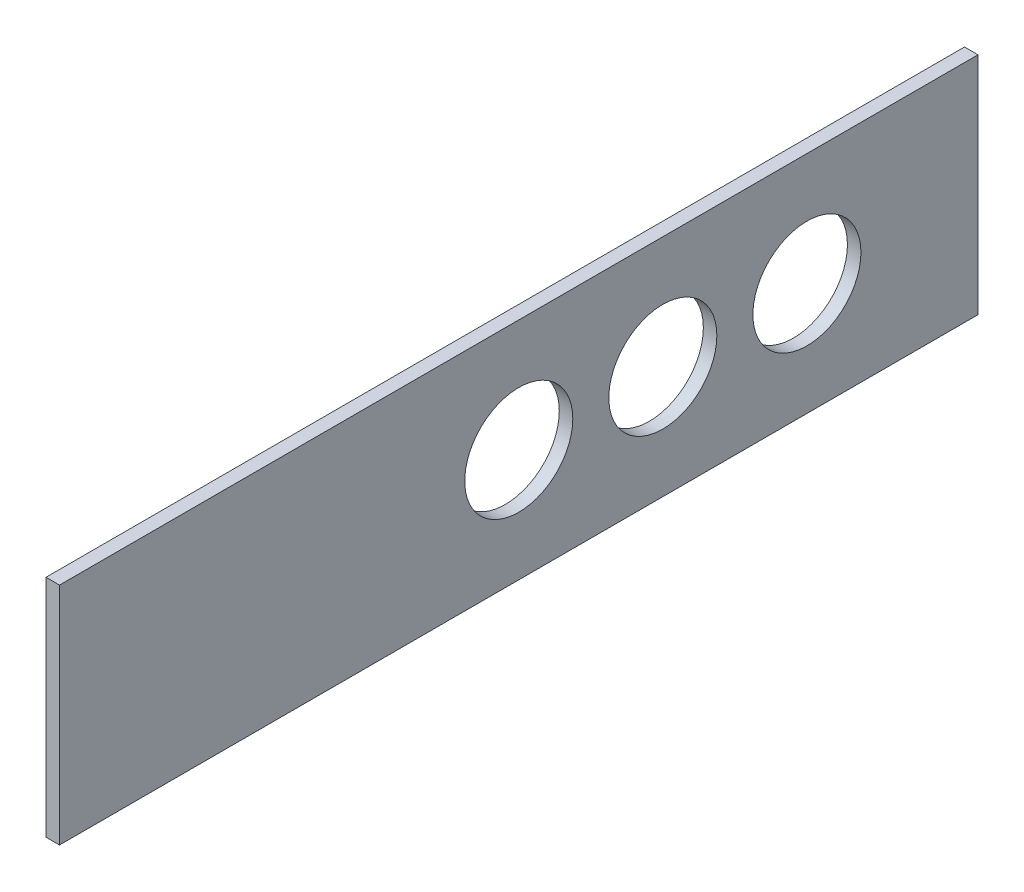
ISO-10303-21;
HEADER;
FILE_DESCRIPTION(('STEP AP214'),'2;1');
FILE_NAME('part.step','',(''),(''),'','','');
FILE_SCHEMA(('AUTOMOTIVE_DESIGN { 1 0 10303 214 1 1 1 1 }'));
ENDSEC;
DATA;
#1=APPLICATION_CONTEXT('core data for automotive mechanical design processes');
#2=APPLICATION_PROTOCOL_DEFINITION('international standard','automotive_design',2000,#1);
#3=PRODUCT_CONTEXT('',#1,'mechanical');
#4=PRODUCT('Part','Part','',(#3));
#5=PRODUCT_RELATED_PRODUCT_CATEGORY('part','',(#4));
#6=PRODUCT_DEFINITION_FORMATION('','',#4);
#7=PRODUCT_DEFINITION_CONTEXT('part definition',#1,'design');
#8=PRODUCT_DEFINITION('design','',#6,#7);
#9=PRODUCT_DEFINITION_SHAPE('','',#8);
#10=(LENGTH_UNIT() NAMED_UNIT(*) SI_UNIT(.MILLI.,.METRE.));
#11=(NAMED_UNIT(*) PLANE_ANGLE_UNIT() SI_UNIT($,.RADIAN.));
#12=(NAMED_UNIT(*) SI_UNIT($,.STERADIAN.) SOLID_ANGLE_UNIT());
#13=UNCERTAINTY_MEASURE_WITH_UNIT(LENGTH_MEASURE(1.E-05),#10,'distance_accuracy_value','');
#14=(GEOMETRIC_REPRESENTATION_CONTEXT(3) GLOBAL_UNCERTAINTY_ASSIGNED_CONTEXT((#13)) GLOBAL_UNIT_ASSIGNED_CONTEXT((#10,
#11,#12)) REPRESENTATION_CONTEXT('',''));
#15=CARTESIAN_POINT('',(0.,0.,0.));
#16=DIRECTION('',(0.,0.,1.));
#17=DIRECTION('',(1.,0.,0.));
#18=AXIS2_PLACEMENT_3D('',#15,#16,#17);
#19=CARTESIAN_POINT('',(3.,-12.1514712163296,0.));
#20=DIRECTION('',(0.,1.,0.));
#21=DIRECTION('',(0.,0.,1.));
#22=AXIS2_PLACEMENT_3D('',#19,#20,#21);
#23=PLANE('',#22);
#24=DIRECTION('',(0.,0.,-1.));
#25=VECTOR('',#24,1.);
#26=CARTESIAN_POINT('',(0.,-12.1514712163296,0.));
#27=LINE('',#26,#25);
#28=CARTESIAN_POINT('',(0.,-12.1514712163296,75.6787660537879));
#29=VERTEX_POINT('',#28);
#30=CARTESIAN_POINT('',(0.,-12.1514712163296,-128.321233946212));
#31=VERTEX_POINT('',#30);
#32=EDGE_CURVE('E121',#29,#31,#27,.T.);
#33=ORIENTED_EDGE('',*,*,#32,.T.);
#34=DIRECTION('',(-1.,0.,0.));
#35=VECTOR('',#34,1.);
#36=CARTESIAN_POINT('',(3.,-12.1514712163296,-128.321233946212));
#37=LINE('',#36,#35);
#38=CARTESIAN_POINT('',(3.,-12.1514712163296,-128.321233946212));
#39=VERTEX_POINT('',#38);
#40=EDGE_CURVE('E11',#39,#31,#37,.T.);
#41=ORIENTED_EDGE('',*,*,#40,.F.);
#42=DIRECTION('',(0.,0.,-1.));
#43=VECTOR('',#42,1.);
#44=CARTESIAN_POINT('',(3.,-12.1514712163296,0.));
#45=LINE('',#44,#43);
#46=CARTESIAN_POINT('',(3.,-12.1514712163296,75.6787660537879));
#47=VERTEX_POINT('',#46);
#48=EDGE_CURVE('E82',#47,#39,#45,.T.);
#49=ORIENTED_EDGE('',*,*,#48,.F.);
#50=DIRECTION('',(-1.,0.,0.));
#51=VECTOR('',#50,1.);
#52=CARTESIAN_POINT('',(3.,-12.1514712163296,75.6787660537879));
#53=LINE('',#52,#51);
#54=EDGE_CURVE('E105',#47,#29,#53,.T.);
#55=ORIENTED_EDGE('',*,*,#54,.T.);
#56=EDGE_LOOP('',(#33,#41,#49,#55));
#57=FACE_BOUND('',#56,.T.);
#58=ADVANCED_FACE('F41',(#57),#23,.F.);
#59=CARTESIAN_POINT('',(3.,0.,-128.321233946212));
#60=DIRECTION('',(0.,0.,-1.));
#61=DIRECTION('',(0.,1.,0.));
#62=AXIS2_PLACEMENT_3D('',#59,#60,#61);
#63=PLANE('',#62);
#64=DIRECTION('',(0.,-1.,0.));
#65=VECTOR('',#64,1.);
#66=CARTESIAN_POINT('',(0.,0.,-128.321233946212));
#67=LINE('',#66,#65);
#68=CARTESIAN_POINT('',(0.,37.8485287836704,-128.321233946212));
#69=VERTEX_POINT('',#68);
#70=EDGE_CURVE('E91',#69,#31,#67,.T.);
#71=ORIENTED_EDGE('',*,*,#70,.F.);
#72=DIRECTION('',(-1.,0.,0.));
#73=VECTOR('',#72,1.);
#74=CARTESIAN_POINT('',(3.,37.8485287836704,-128.321233946212));
#75=LINE('',#74,#73);
#76=CARTESIAN_POINT('',(3.,37.8485287836704,-128.321233946212));
#77=VERTEX_POINT('',#76);
#78=EDGE_CURVE('E51',#77,#69,#75,.T.);
#79=ORIENTED_EDGE('',*,*,#78,.F.);
#80=DIRECTION('',(0.,-1.,0.));
#81=VECTOR('',#80,1.);
#82=CARTESIAN_POINT('',(3.,0.,-128.321233946212));
#83=LINE('',#82,#81);
#84=EDGE_CURVE('E89',#77,#39,#83,.T.);
#85=ORIENTED_EDGE('',*,*,#84,.T.);
#86=ORIENTED_EDGE('',*,*,#40,.T.);
#87=EDGE_LOOP('',(#71,#79,#85,#86));
#88=FACE_BOUND('',#87,.T.);
#89=ADVANCED_FACE('F88',(#88),#63,.T.);
#90=CARTESIAN_POINT('',(3.,37.8485287836703,0.));
#91=DIRECTION('',(0.,1.,0.));
#92=DIRECTION('',(0.,0.,1.));
#93=AXIS2_PLACEMENT_3D('',#90,#91,#92);
#94=PLANE('',#93);
#95=DIRECTION('',(0.,0.,-1.));
#96=VECTOR('',#95,1.);
#97=CARTESIAN_POINT('',(0.,37.8485287836703,0.));
#98=LINE('',#97,#96);
#99=CARTESIAN_POINT('',(0.,37.8485287836703,75.6787660537879));
#100=VERTEX_POINT('',#99);
#101=EDGE_CURVE('E127',#100,#69,#98,.T.);
#102=ORIENTED_EDGE('',*,*,#101,.F.);
#103=DIRECTION('',(-1.,0.,0.));
#104=VECTOR('',#103,1.);
#105=CARTESIAN_POINT('',(3.,37.8485287836703,75.6787660537879));
#106=LINE('',#105,#104);
#107=CARTESIAN_POINT('',(3.,37.8485287836703,75.6787660537879));
#108=VERTEX_POINT('',#107);
#109=EDGE_CURVE('E74',#108,#100,#106,.T.);
#110=ORIENTED_EDGE('',*,*,#109,.F.);
#111=DIRECTION('',(0.,0.,-1.));
#112=VECTOR('',#111,1.);
#113=CARTESIAN_POINT('',(3.,37.8485287836703,0.));
#114=LINE('',#113,#112);
#115=EDGE_CURVE('E98',#108,#77,#114,.T.);
#116=ORIENTED_EDGE('',*,*,#115,.T.);
#117=ORIENTED_EDGE('',*,*,#78,.T.);
#118=EDGE_LOOP('',(#102,#110,#116,#117));
#119=FACE_BOUND('',#118,.T.);
#120=ADVANCED_FACE('F101',(#119),#94,.T.);
#121=CARTESIAN_POINT('',(3.,12.8485287836704,-26.3212339462121));
#122=DIRECTION('',(-1.,0.,0.));
#123=DIRECTION('',(0.,0.,1.));
#124=AXIS2_PLACEMENT_3D('',#121,#122,#123);
#125=CYLINDRICAL_SURFACE('',#124,12.);
#126=CARTESIAN_POINT('',(3.,12.8485287836704,-26.3212339462121));
#127=DIRECTION('',(1.,0.,0.));
#128=DIRECTION('',(0.,0.,-1.));
#129=AXIS2_PLACEMENT_3D('',#126,#127,#128);
#130=CIRCLE('',#129,12.);
#131=CARTESIAN_POINT('',(3.,12.8485287836704,-38.3212339462121));
#132=VERTEX_POINT('',#131);
#133=EDGE_CURVE('E179',#132,#132,#130,.T.);
#134=ORIENTED_EDGE('',*,*,#133,.T.);
#135=EDGE_LOOP('',(#134));
#136=FACE_BOUND('',#135,.T.);
#137=CARTESIAN_POINT('',(0.,12.8485287836704,-26.3212339462121));
#138=DIRECTION('',(1.,0.,0.));
#139=DIRECTION('',(0.,0.,-1.));
#140=AXIS2_PLACEMENT_3D('',#137,#138,#139);
#141=CIRCLE('',#140,12.);
#142=CARTESIAN_POINT('',(0.,12.8485287836704,-38.3212339462121));
#143=VERTEX_POINT('',#142);
#144=EDGE_CURVE('E117',#143,#143,#141,.T.);
#145=ORIENTED_EDGE('',*,*,#144,.F.);
#146=EDGE_LOOP('',(#145));
#147=FACE_BOUND('',#146,.T.);
#148=ADVANCED_FACE('F159',(#136,#147),#125,.F.);
#149=CARTESIAN_POINT('',(3.,12.8485287836704,-58.3212339462121));
#150=DIRECTION('',(-1.,0.,0.));
#151=DIRECTION('',(0.,0.,1.));
#152=AXIS2_PLACEMENT_3D('',#149,#150,#151);
#153=CYLINDRICAL_SURFACE('',#152,12.);
#154=CARTESIAN_POINT('',(3.,12.8485287836704,-58.3212339462121));
#155=DIRECTION('',(1.,0.,0.));
#156=DIRECTION('',(0.,0.,-1.));
#157=AXIS2_PLACEMENT_3D('',#154,#155,#156);
#158=CIRCLE('',#157,12.);
#159=CARTESIAN_POINT('',(3.,12.8485287836704,-70.3212339462121));
#160=VERTEX_POINT('',#159);
#161=EDGE_CURVE('E172',#160,#160,#158,.T.);
#162=ORIENTED_EDGE('',*,*,#161,.T.);
#163=EDGE_LOOP('',(#162));
#164=FACE_BOUND('',#163,.T.);
#165=CARTESIAN_POINT('',(0.,12.8485287836704,-58.3212339462121));
#166=DIRECTION('',(1.,0.,0.));
#167=DIRECTION('',(0.,0.,-1.));
#168=AXIS2_PLACEMENT_3D('',#165,#166,#167);
#169=CIRCLE('',#168,12.);
#170=CARTESIAN_POINT('',(0.,12.8485287836704,-70.3212339462121));
#171=VERTEX_POINT('',#170);
#172=EDGE_CURVE('E113',#171,#171,#169,.T.);
#173=ORIENTED_EDGE('',*,*,#172,.F.);
#174=EDGE_LOOP('',(#173));
#175=FACE_BOUND('',#174,.T.);
#176=ADVANCED_FACE('F161',(#164,#175),#153,.F.);
#177=CARTESIAN_POINT('',(3.,12.8485287836704,-90.3212339462121));
#178=DIRECTION('',(-1.,0.,0.));
#179=DIRECTION('',(0.,0.,1.));
#180=AXIS2_PLACEMENT_3D('',#177,#178,#179);
#181=CYLINDRICAL_SURFACE('',#180,12.);
#182=CARTESIAN_POINT('',(3.,12.8485287836704,-90.3212339462121));
#183=DIRECTION('',(1.,0.,0.));
#184=DIRECTION('',(0.,0.,-1.));
#185=AXIS2_PLACEMENT_3D('',#182,#183,#184);
#186=CIRCLE('',#185,12.);
#187=CARTESIAN_POINT('',(3.,12.8485287836704,-102.321233946212));
#188=VERTEX_POINT('',#187);
#189=EDGE_CURVE('E132',#188,#188,#186,.T.);
#190=ORIENTED_EDGE('',*,*,#189,.T.);
#191=EDGE_LOOP('',(#190));
#192=FACE_BOUND('',#191,.T.);
#193=CARTESIAN_POINT('',(0.,12.8485287836704,-90.3212339462121));
#194=DIRECTION('',(1.,0.,0.));
#195=DIRECTION('',(0.,0.,-1.));
#196=AXIS2_PLACEMENT_3D('',#193,#194,#195);
#197=CIRCLE('',#196,12.);
#198=CARTESIAN_POINT('',(0.,12.8485287836704,-102.321233946212));
#199=VERTEX_POINT('',#198);
#200=EDGE_CURVE('E109',#199,#199,#197,.T.);
#201=ORIENTED_EDGE('',*,*,#200,.F.);
#202=EDGE_LOOP('',(#201));
#203=FACE_BOUND('',#202,.T.);
#204=ADVANCED_FACE('F43',(#192,#203),#181,.F.);
#205=CARTESIAN_POINT('',(3.,0.,75.6787660537879));
#206=DIRECTION('',(0.,0.,-1.));
#207=DIRECTION('',(-1.,0.,0.));
#208=AXIS2_PLACEMENT_3D('',#205,#206,#207);
#209=PLANE('',#208);
#210=DIRECTION('',(0.,-1.,0.));
#211=VECTOR('',#210,1.);
#212=CARTESIAN_POINT('',(0.,0.,75.6787660537879));
#213=LINE('',#212,#211);
#214=EDGE_CURVE('E77',#100,#29,#213,.T.);
#215=ORIENTED_EDGE('',*,*,#214,.T.);
#216=ORIENTED_EDGE('',*,*,#54,.F.);
#217=DIRECTION('',(0.,-1.,0.));
#218=VECTOR('',#217,1.);
#219=CARTESIAN_POINT('',(3.,0.,75.6787660537879));
#220=LINE('',#219,#218);
#221=EDGE_CURVE('E59',#108,#47,#220,.T.);
#222=ORIENTED_EDGE('',*,*,#221,.F.);
#223=ORIENTED_EDGE('',*,*,#109,.T.);
#224=EDGE_LOOP('',(#215,#216,#222,#223));
#225=FACE_BOUND('',#224,.T.);
#226=ADVANCED_FACE('F146',(#225),#209,.F.);
#227=CARTESIAN_POINT('',(3.,0.,0.));
#228=DIRECTION('',(1.,0.,0.));
#229=DIRECTION('',(0.,0.,-1.));
#230=AXIS2_PLACEMENT_3D('',#227,#228,#229);
#231=PLANE('',#230);
#232=ORIENTED_EDGE('',*,*,#189,.F.);
#233=EDGE_LOOP('',(#232));
#234=FACE_BOUND('',#233,.T.);
#235=ORIENTED_EDGE('',*,*,#161,.F.);
#236=EDGE_LOOP('',(#235));
#237=FACE_BOUND('',#236,.T.);
#238=ORIENTED_EDGE('',*,*,#133,.F.);
#239=EDGE_LOOP('',(#238));
#240=FACE_BOUND('',#239,.T.);
#241=ORIENTED_EDGE('',*,*,#48,.T.);
#242=ORIENTED_EDGE('',*,*,#84,.F.);
#243=ORIENTED_EDGE('',*,*,#115,.F.);
#244=ORIENTED_EDGE('',*,*,#221,.T.);
#245=EDGE_LOOP('',(#241,#242,#243,#244));
#246=FACE_BOUND('',#245,.T.);
#247=ADVANCED_FACE('F97',(#234,#237,#240,#246),#231,.T.);
#248=CARTESIAN_POINT('',(0.,0.,0.));
#249=DIRECTION('',(1.,0.,0.));
#250=DIRECTION('',(0.,0.,-1.));
#251=AXIS2_PLACEMENT_3D('',#248,#249,#250);
#252=PLANE('',#251);
#253=ORIENTED_EDGE('',*,*,#200,.T.);
#254=EDGE_LOOP('',(#253));
#255=FACE_BOUND('',#254,.T.);
#256=ORIENTED_EDGE('',*,*,#172,.T.);
#257=EDGE_LOOP('',(#256));
#258=FACE_BOUND('',#257,.T.);
#259=ORIENTED_EDGE('',*,*,#144,.T.);
#260=EDGE_LOOP('',(#259));
#261=FACE_BOUND('',#260,.T.);
#262=ORIENTED_EDGE('',*,*,#32,.F.);
#263=ORIENTED_EDGE('',*,*,#214,.F.);
#264=ORIENTED_EDGE('',*,*,#101,.T.);
#265=ORIENTED_EDGE('',*,*,#70,.T.);
#266=EDGE_LOOP('',(#262,#263,#264,#265));
#267=FACE_BOUND('',#266,.T.);
#268=ADVANCED_FACE('F139',(#255,#258,#261,#267),#252,.F.);
#269=CLOSED_SHELL('',(#58,#89,#120,#148,#176,#204,#226,#247,#268));
#270=MANIFOLD_SOLID_BREP('B2',#269);
#271=ADVANCED_BREP_SHAPE_REPRESENTATION('',(#18,#270),#14);
#272=SHAPE_DEFINITION_REPRESENTATION(#9,#271);
ENDSEC;
END-ISO-10303-21;
